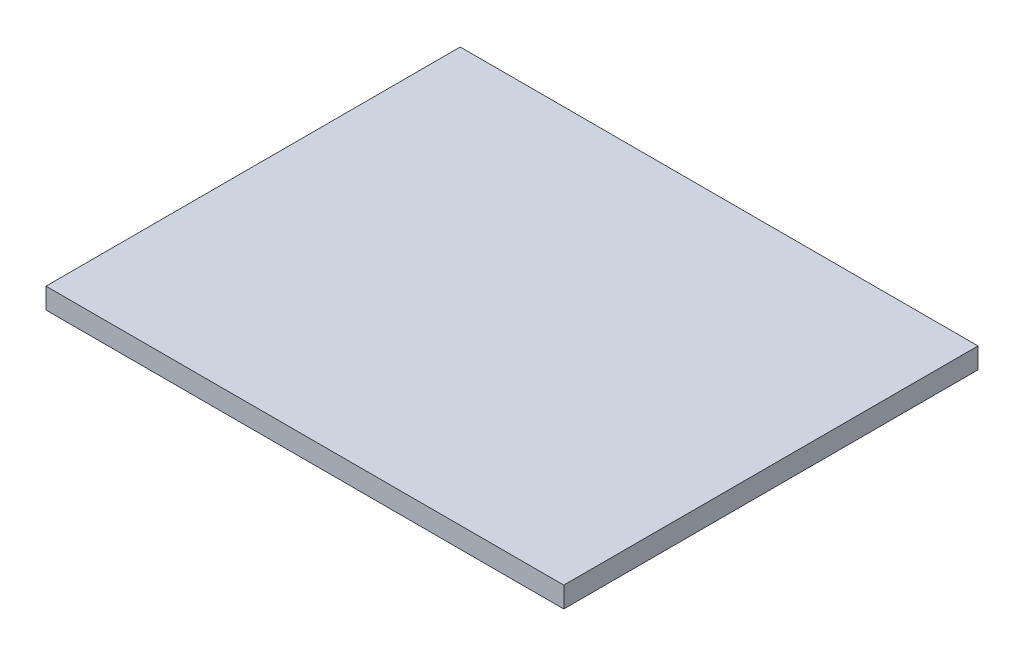
ISO-10303-21;
HEADER;
FILE_DESCRIPTION(('STEP AP214'),'2;1');
FILE_NAME('part.step','',(''),(''),'','','');
FILE_SCHEMA(('AUTOMOTIVE_DESIGN { 1 0 10303 214 1 1 1 1 }'));
ENDSEC;
DATA;
#1=APPLICATION_CONTEXT('core data for automotive mechanical design processes');
#2=APPLICATION_PROTOCOL_DEFINITION('international standard','automotive_design',2000,#1);
#3=PRODUCT_CONTEXT('',#1,'mechanical');
#4=PRODUCT('Part','Part','',(#3));
#5=PRODUCT_RELATED_PRODUCT_CATEGORY('part','',(#4));
#6=PRODUCT_DEFINITION_FORMATION('','',#4);
#7=PRODUCT_DEFINITION_CONTEXT('part definition',#1,'design');
#8=PRODUCT_DEFINITION('design','',#6,#7);
#9=PRODUCT_DEFINITION_SHAPE('','',#8);
#10=(LENGTH_UNIT() NAMED_UNIT(*) SI_UNIT(.MILLI.,.METRE.));
#11=(NAMED_UNIT(*) PLANE_ANGLE_UNIT() SI_UNIT($,.RADIAN.));
#12=(NAMED_UNIT(*) SI_UNIT($,.STERADIAN.) SOLID_ANGLE_UNIT());
#13=UNCERTAINTY_MEASURE_WITH_UNIT(LENGTH_MEASURE(1.E-05),#10,'distance_accuracy_value','');
#14=(GEOMETRIC_REPRESENTATION_CONTEXT(3) GLOBAL_UNCERTAINTY_ASSIGNED_CONTEXT((#13)) GLOBAL_UNIT_ASSIGNED_CONTEXT((#10,
#11,#12)) REPRESENTATION_CONTEXT('',''));
#15=CARTESIAN_POINT('',(0.,0.,0.));
#16=DIRECTION('',(0.,0.,1.));
#17=DIRECTION('',(1.,0.,0.));
#18=AXIS2_PLACEMENT_3D('',#15,#16,#17);
#19=CARTESIAN_POINT('',(-2500.,200.,2000.));
#20=DIRECTION('',(1.,0.,0.));
#21=DIRECTION('',(0.,0.,-1.));
#22=AXIS2_PLACEMENT_3D('',#19,#20,#21);
#23=PLANE('',#22);
#24=DIRECTION('',(0.,0.,1.));
#25=VECTOR('',#24,1.);
#26=CARTESIAN_POINT('',(-2500.,0.,2000.));
#27=LINE('',#26,#25);
#28=CARTESIAN_POINT('',(-2500.,0.,-2000.));
#29=VERTEX_POINT('',#28);
#30=CARTESIAN_POINT('',(-2500.,0.,2000.));
#31=VERTEX_POINT('',#30);
#32=EDGE_CURVE('E98',#29,#31,#27,.T.);
#33=ORIENTED_EDGE('',*,*,#32,.T.);
#34=DIRECTION('',(0.,-1.,0.));
#35=VECTOR('',#34,1.);
#36=CARTESIAN_POINT('',(-2500.,200.,2000.));
#37=LINE('',#36,#35);
#38=CARTESIAN_POINT('',(-2500.,200.,2000.));
#39=VERTEX_POINT('',#38);
#40=EDGE_CURVE('E11',#39,#31,#37,.T.);
#41=ORIENTED_EDGE('',*,*,#40,.F.);
#42=DIRECTION('',(0.,0.,1.));
#43=VECTOR('',#42,1.);
#44=CARTESIAN_POINT('',(-2500.,200.,2000.));
#45=LINE('',#44,#43);
#46=CARTESIAN_POINT('',(-2500.,200.,-2000.));
#47=VERTEX_POINT('',#46);
#48=EDGE_CURVE('E86',#47,#39,#45,.T.);
#49=ORIENTED_EDGE('',*,*,#48,.F.);
#50=DIRECTION('',(0.,-1.,0.));
#51=VECTOR('',#50,1.);
#52=CARTESIAN_POINT('',(-2500.,200.,-2000.));
#53=LINE('',#52,#51);
#54=EDGE_CURVE('E94',#47,#29,#53,.T.);
#55=ORIENTED_EDGE('',*,*,#54,.T.);
#56=EDGE_LOOP('',(#33,#41,#49,#55));
#57=FACE_BOUND('',#56,.T.);
#58=ADVANCED_FACE('F35',(#57),#23,.F.);
#59=CARTESIAN_POINT('',(2500.,200.,2000.));
#60=DIRECTION('',(0.,0.,-1.));
#61=DIRECTION('',(-1.,0.,0.));
#62=AXIS2_PLACEMENT_3D('',#59,#60,#61);
#63=PLANE('',#62);
#64=DIRECTION('',(1.,0.,0.));
#65=VECTOR('',#64,1.);
#66=CARTESIAN_POINT('',(2500.,0.,2000.));
#67=LINE('',#66,#65);
#68=CARTESIAN_POINT('',(2500.,0.,2000.));
#69=VERTEX_POINT('',#68);
#70=EDGE_CURVE('E90',#31,#69,#67,.T.);
#71=ORIENTED_EDGE('',*,*,#70,.T.);
#72=DIRECTION('',(0.,-1.,0.));
#73=VECTOR('',#72,1.);
#74=CARTESIAN_POINT('',(2500.,200.,2000.));
#75=LINE('',#74,#73);
#76=CARTESIAN_POINT('',(2500.,200.,2000.));
#77=VERTEX_POINT('',#76);
#78=EDGE_CURVE('E43',#77,#69,#75,.T.);
#79=ORIENTED_EDGE('',*,*,#78,.F.);
#80=DIRECTION('',(1.,0.,0.));
#81=VECTOR('',#80,1.);
#82=CARTESIAN_POINT('',(2500.,200.,2000.));
#83=LINE('',#82,#81);
#84=EDGE_CURVE('E81',#39,#77,#83,.T.);
#85=ORIENTED_EDGE('',*,*,#84,.F.);
#86=ORIENTED_EDGE('',*,*,#40,.T.);
#87=EDGE_LOOP('',(#71,#79,#85,#86));
#88=FACE_BOUND('',#87,.T.);
#89=ADVANCED_FACE('F89',(#88),#63,.F.);
#90=CARTESIAN_POINT('',(2500.,200.,2000.));
#91=DIRECTION('',(-1.,0.,0.));
#92=DIRECTION('',(0.,0.,1.));
#93=AXIS2_PLACEMENT_3D('',#90,#91,#92);
#94=PLANE('',#93);
#95=DIRECTION('',(0.,0.,-1.));
#96=VECTOR('',#95,1.);
#97=CARTESIAN_POINT('',(2500.,0.,2000.));
#98=LINE('',#97,#96);
#99=CARTESIAN_POINT('',(2500.,0.,-2000.));
#100=VERTEX_POINT('',#99);
#101=EDGE_CURVE('E68',#69,#100,#98,.T.);
#102=ORIENTED_EDGE('',*,*,#101,.T.);
#103=DIRECTION('',(0.,-1.,0.));
#104=VECTOR('',#103,1.);
#105=CARTESIAN_POINT('',(2500.,200.,-2000.));
#106=LINE('',#105,#104);
#107=CARTESIAN_POINT('',(2500.,200.,-2000.));
#108=VERTEX_POINT('',#107);
#109=EDGE_CURVE('E91',#108,#100,#106,.T.);
#110=ORIENTED_EDGE('',*,*,#109,.F.);
#111=DIRECTION('',(0.,0.,-1.));
#112=VECTOR('',#111,1.);
#113=CARTESIAN_POINT('',(2500.,200.,2000.));
#114=LINE('',#113,#112);
#115=EDGE_CURVE('E84',#77,#108,#114,.T.);
#116=ORIENTED_EDGE('',*,*,#115,.F.);
#117=ORIENTED_EDGE('',*,*,#78,.T.);
#118=EDGE_LOOP('',(#102,#110,#116,#117));
#119=FACE_BOUND('',#118,.T.);
#120=ADVANCED_FACE('F92',(#119),#94,.F.);
#121=CARTESIAN_POINT('',(2500.,200.,-2000.));
#122=DIRECTION('',(0.,0.,1.));
#123=DIRECTION('',(1.,0.,0.));
#124=AXIS2_PLACEMENT_3D('',#121,#122,#123);
#125=PLANE('',#124);
#126=DIRECTION('',(-1.,0.,0.));
#127=VECTOR('',#126,1.);
#128=CARTESIAN_POINT('',(2500.,0.,-2000.));
#129=LINE('',#128,#127);
#130=EDGE_CURVE('E74',#100,#29,#129,.T.);
#131=ORIENTED_EDGE('',*,*,#130,.T.);
#132=ORIENTED_EDGE('',*,*,#54,.F.);
#133=DIRECTION('',(-1.,0.,0.));
#134=VECTOR('',#133,1.);
#135=CARTESIAN_POINT('',(2500.,200.,-2000.));
#136=LINE('',#135,#134);
#137=EDGE_CURVE('E51',#108,#47,#136,.T.);
#138=ORIENTED_EDGE('',*,*,#137,.F.);
#139=ORIENTED_EDGE('',*,*,#109,.T.);
#140=EDGE_LOOP('',(#131,#132,#138,#139));
#141=FACE_BOUND('',#140,.T.);
#142=ADVANCED_FACE('F105',(#141),#125,.F.);
#143=CARTESIAN_POINT('',(0.,200.,0.));
#144=DIRECTION('',(0.,1.,0.));
#145=DIRECTION('',(0.,0.,1.));
#146=AXIS2_PLACEMENT_3D('',#143,#144,#145);
#147=PLANE('',#146);
#148=ORIENTED_EDGE('',*,*,#48,.T.);
#149=ORIENTED_EDGE('',*,*,#84,.T.);
#150=ORIENTED_EDGE('',*,*,#115,.T.);
#151=ORIENTED_EDGE('',*,*,#137,.T.);
#152=EDGE_LOOP('',(#148,#149,#150,#151));
#153=FACE_BOUND('',#152,.T.);
#154=ADVANCED_FACE('F82',(#153),#147,.T.);
#155=CARTESIAN_POINT('',(0.,0.,0.));
#156=DIRECTION('',(0.,1.,0.));
#157=DIRECTION('',(0.,0.,1.));
#158=AXIS2_PLACEMENT_3D('',#155,#156,#157);
#159=PLANE('',#158);
#160=ORIENTED_EDGE('',*,*,#32,.F.);
#161=ORIENTED_EDGE('',*,*,#130,.F.);
#162=ORIENTED_EDGE('',*,*,#101,.F.);
#163=ORIENTED_EDGE('',*,*,#70,.F.);
#164=EDGE_LOOP('',(#160,#161,#162,#163));
#165=FACE_BOUND('',#164,.T.);
#166=ADVANCED_FACE('F108',(#165),#159,.F.);
#167=CLOSED_SHELL('',(#58,#89,#120,#142,#154,#166));
#168=MANIFOLD_SOLID_BREP('B2',#167);
#169=ADVANCED_BREP_SHAPE_REPRESENTATION('',(#18,#168),#14);
#170=SHAPE_DEFINITION_REPRESENTATION(#9,#169);
ENDSEC;
END-ISO-10303-21;
